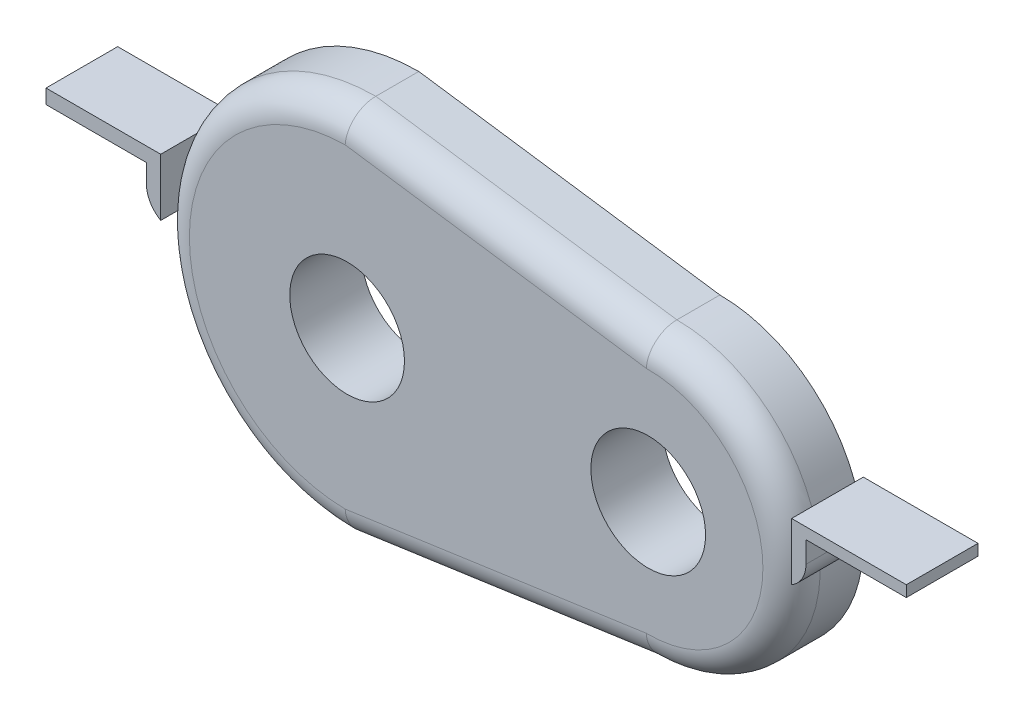
ISO-10303-21;
HEADER;
FILE_DESCRIPTION(('STEP AP214'),'2;1');
FILE_NAME('part.step','',(''),(''),'','','');
FILE_SCHEMA(('AUTOMOTIVE_DESIGN { 1 0 10303 214 1 1 1 1 }'));
ENDSEC;
DATA;
#1=APPLICATION_CONTEXT('core data for automotive mechanical design processes');
#2=APPLICATION_PROTOCOL_DEFINITION('international standard','automotive_design',2000,#1);
#3=PRODUCT_CONTEXT('',#1,'mechanical');
#4=PRODUCT('Part','Part','',(#3));
#5=PRODUCT_RELATED_PRODUCT_CATEGORY('part','',(#4));
#6=PRODUCT_DEFINITION_FORMATION('','',#4);
#7=PRODUCT_DEFINITION_CONTEXT('part definition',#1,'design');
#8=PRODUCT_DEFINITION('design','',#6,#7);
#9=PRODUCT_DEFINITION_SHAPE('','',#8);
#10=(LENGTH_UNIT() NAMED_UNIT(*) SI_UNIT(.MILLI.,.METRE.));
#11=(NAMED_UNIT(*) PLANE_ANGLE_UNIT() SI_UNIT($,.RADIAN.));
#12=(NAMED_UNIT(*) SI_UNIT($,.STERADIAN.) SOLID_ANGLE_UNIT());
#13=UNCERTAINTY_MEASURE_WITH_UNIT(LENGTH_MEASURE(1.E-05),#10,'distance_accuracy_value','');
#14=(GEOMETRIC_REPRESENTATION_CONTEXT(3) GLOBAL_UNCERTAINTY_ASSIGNED_CONTEXT((#13)) GLOBAL_UNIT_ASSIGNED_CONTEXT((#10,
#11,#12)) REPRESENTATION_CONTEXT('',''));
#15=CARTESIAN_POINT('',(0.,0.,0.));
#16=DIRECTION('',(0.,0.,1.));
#17=DIRECTION('',(1.,0.,0.));
#18=AXIS2_PLACEMENT_3D('',#15,#16,#17);
#19=CARTESIAN_POINT('',(-126.962868969595,20.,0.));
#20=DIRECTION('',(1.,0.,0.));
#21=DIRECTION('',(0.,0.,-1.));
#22=AXIS2_PLACEMENT_3D('',#19,#20,#21);
#23=PLANE('',#22);
#24=DIRECTION('',(0.,1.,0.));
#25=VECTOR('',#24,1.);
#26=CARTESIAN_POINT('',(-126.962868969595,20.,25.));
#27=LINE('',#26,#25);
#28=CARTESIAN_POINT('',(-126.962868969595,0.,25.));
#29=VERTEX_POINT('',#28);
#30=CARTESIAN_POINT('',(-126.962868969595,20.,25.));
#31=VERTEX_POINT('',#30);
#32=EDGE_CURVE('E129',#29,#31,#27,.T.);
#33=ORIENTED_EDGE('',*,*,#32,.F.);
#34=DIRECTION('',(0.,0.,1.));
#35=VECTOR('',#34,1.);
#36=CARTESIAN_POINT('',(-126.962868969595,0.,0.));
#37=LINE('',#36,#35);
#38=CARTESIAN_POINT('',(-126.962868969595,0.,0.));
#39=VERTEX_POINT('',#38);
#40=EDGE_CURVE('E117',#39,#29,#37,.T.);
#41=ORIENTED_EDGE('',*,*,#40,.F.);
#42=DIRECTION('',(0.,1.,0.));
#43=VECTOR('',#42,1.);
#44=CARTESIAN_POINT('',(-126.962868969595,20.,0.));
#45=LINE('',#44,#43);
#46=CARTESIAN_POINT('',(-126.962868969595,20.,0.));
#47=VERTEX_POINT('',#46);
#48=EDGE_CURVE('E112',#39,#47,#45,.T.);
#49=ORIENTED_EDGE('',*,*,#48,.T.);
#50=DIRECTION('',(0.,0.,1.));
#51=VECTOR('',#50,1.);
#52=CARTESIAN_POINT('',(-126.962868969595,20.,0.));
#53=LINE('',#52,#51);
#54=EDGE_CURVE('E97',#47,#31,#53,.T.);
#55=ORIENTED_EDGE('',*,*,#54,.T.);
#56=EDGE_LOOP('',(#33,#41,#49,#55));
#57=FACE_BOUND('',#56,.T.);
#58=ADVANCED_FACE('F44',(#57),#23,.T.);
#59=CARTESIAN_POINT('',(-131.962868969595,0.,0.));
#60=DIRECTION('',(-1.,0.,0.));
#61=DIRECTION('',(0.,0.,1.));
#62=AXIS2_PLACEMENT_3D('',#59,#60,#61);
#63=PLANE('',#62);
#64=DIRECTION('',(0.,-1.,0.));
#65=VECTOR('',#64,1.);
#66=CARTESIAN_POINT('',(-131.962868969595,0.,0.));
#67=LINE('',#66,#65);
#68=CARTESIAN_POINT('',(-131.962868969595,15.,0.));
#69=VERTEX_POINT('',#68);
#70=CARTESIAN_POINT('',(-131.962868969595,8.6602540378444,0.));
#71=VERTEX_POINT('',#70);
#72=EDGE_CURVE('E108',#69,#71,#67,.T.);
#73=ORIENTED_EDGE('',*,*,#72,.T.);
#74=DIRECTION('',(0.,0.,-1.));
#75=VECTOR('',#74,1.);
#76=CARTESIAN_POINT('',(-131.962868969595,8.6602540378444,25.));
#77=LINE('',#76,#75);
#78=CARTESIAN_POINT('',(-131.962868969595,8.6602540378444,25.));
#79=VERTEX_POINT('',#78);
#80=EDGE_CURVE('E138',#71,#79,#77,.F.);
#81=ORIENTED_EDGE('',*,*,#80,.T.);
#82=DIRECTION('',(0.,-1.,0.));
#83=VECTOR('',#82,1.);
#84=CARTESIAN_POINT('',(-131.962868969595,0.,25.));
#85=LINE('',#84,#83);
#86=CARTESIAN_POINT('',(-131.962868969595,15.,25.));
#87=VERTEX_POINT('',#86);
#88=EDGE_CURVE('E118',#87,#79,#85,.T.);
#89=ORIENTED_EDGE('',*,*,#88,.F.);
#90=DIRECTION('',(0.,0.,1.));
#91=VECTOR('',#90,1.);
#92=CARTESIAN_POINT('',(-131.962868969595,15.,0.));
#93=LINE('',#92,#91);
#94=EDGE_CURVE('E139',#69,#87,#93,.T.);
#95=ORIENTED_EDGE('',*,*,#94,.F.);
#96=EDGE_LOOP('',(#73,#81,#89,#95));
#97=FACE_BOUND('',#96,.T.);
#98=ADVANCED_FACE('F148',(#97),#63,.T.);
#99=CARTESIAN_POINT('',(-131.962868969595,15.,0.));
#100=DIRECTION('',(0.,-1.,0.));
#101=DIRECTION('',(1.,0.,0.));
#102=AXIS2_PLACEMENT_3D('',#99,#100,#101);
#103=PLANE('',#102);
#104=DIRECTION('',(1.,0.,0.));
#105=VECTOR('',#104,1.);
#106=CARTESIAN_POINT('',(-131.962868969595,15.,25.));
#107=LINE('',#106,#105);
#108=CARTESIAN_POINT('',(-166.962868969595,15.,25.));
#109=VERTEX_POINT('',#108);
#110=EDGE_CURVE('E121',#109,#87,#107,.T.);
#111=ORIENTED_EDGE('',*,*,#110,.F.);
#112=DIRECTION('',(0.,0.,1.));
#113=VECTOR('',#112,1.);
#114=CARTESIAN_POINT('',(-166.962868969595,15.,0.));
#115=LINE('',#114,#113);
#116=CARTESIAN_POINT('',(-166.962868969595,15.,0.));
#117=VERTEX_POINT('',#116);
#118=EDGE_CURVE('E141',#117,#109,#115,.T.);
#119=ORIENTED_EDGE('',*,*,#118,.F.);
#120=DIRECTION('',(1.,0.,0.));
#121=VECTOR('',#120,1.);
#122=CARTESIAN_POINT('',(-131.962868969595,15.,0.));
#123=LINE('',#122,#121);
#124=EDGE_CURVE('E125',#117,#69,#123,.T.);
#125=ORIENTED_EDGE('',*,*,#124,.T.);
#126=ORIENTED_EDGE('',*,*,#94,.T.);
#127=EDGE_LOOP('',(#111,#119,#125,#126));
#128=FACE_BOUND('',#127,.T.);
#129=ADVANCED_FACE('F151',(#128),#103,.T.);
#130=CARTESIAN_POINT('',(-166.962868969595,15.,0.));
#131=DIRECTION('',(-1.,0.,0.));
#132=DIRECTION('',(0.,0.,1.));
#133=AXIS2_PLACEMENT_3D('',#130,#131,#132);
#134=PLANE('',#133);
#135=DIRECTION('',(0.,-1.,0.));
#136=VECTOR('',#135,1.);
#137=CARTESIAN_POINT('',(-166.962868969595,15.,25.));
#138=LINE('',#137,#136);
#139=CARTESIAN_POINT('',(-166.962868969595,20.,25.));
#140=VERTEX_POINT('',#139);
#141=EDGE_CURVE('E132',#140,#109,#138,.T.);
#142=ORIENTED_EDGE('',*,*,#141,.F.);
#143=DIRECTION('',(0.,0.,1.));
#144=VECTOR('',#143,1.);
#145=CARTESIAN_POINT('',(-166.962868969595,20.,0.));
#146=LINE('',#145,#144);
#147=CARTESIAN_POINT('',(-166.962868969595,20.,0.));
#148=VERTEX_POINT('',#147);
#149=EDGE_CURVE('E107',#148,#140,#146,.T.);
#150=ORIENTED_EDGE('',*,*,#149,.F.);
#151=DIRECTION('',(0.,-1.,0.));
#152=VECTOR('',#151,1.);
#153=CARTESIAN_POINT('',(-166.962868969595,15.,0.));
#154=LINE('',#153,#152);
#155=EDGE_CURVE('E115',#148,#117,#154,.T.);
#156=ORIENTED_EDGE('',*,*,#155,.T.);
#157=ORIENTED_EDGE('',*,*,#118,.T.);
#158=EDGE_LOOP('',(#142,#150,#156,#157));
#159=FACE_BOUND('',#158,.T.);
#160=ADVANCED_FACE('F154',(#159),#134,.T.);
#161=CARTESIAN_POINT('',(-166.962868969595,20.,0.));
#162=DIRECTION('',(0.,1.,0.));
#163=DIRECTION('',(0.,0.,1.));
#164=AXIS2_PLACEMENT_3D('',#161,#162,#163);
#165=PLANE('',#164);
#166=DIRECTION('',(-1.,0.,0.));
#167=VECTOR('',#166,1.);
#168=CARTESIAN_POINT('',(-166.962868969595,20.,25.));
#169=LINE('',#168,#167);
#170=EDGE_CURVE('E102',#31,#140,#169,.T.);
#171=ORIENTED_EDGE('',*,*,#170,.F.);
#172=ORIENTED_EDGE('',*,*,#54,.F.);
#173=DIRECTION('',(-1.,0.,0.));
#174=VECTOR('',#173,1.);
#175=CARTESIAN_POINT('',(-166.962868969595,20.,0.));
#176=LINE('',#175,#174);
#177=EDGE_CURVE('E100',#47,#148,#176,.T.);
#178=ORIENTED_EDGE('',*,*,#177,.T.);
#179=ORIENTED_EDGE('',*,*,#149,.T.);
#180=EDGE_LOOP('',(#171,#172,#178,#179));
#181=FACE_BOUND('',#180,.T.);
#182=ADVANCED_FACE('F99',(#181),#165,.T.);
#183=CARTESIAN_POINT('',(0.,0.,0.));
#184=DIRECTION('',(0.,0.,-1.));
#185=DIRECTION('',(-1.,0.,0.));
#186=AXIS2_PLACEMENT_3D('',#183,#184,#185);
#187=PLANE('',#186);
#188=ORIENTED_EDGE('',*,*,#48,.F.);
#189=CARTESIAN_POINT('',(-121.962868969595,8.6602540378444,0.));
#190=DIRECTION('',(0.,0.,-1.));
#191=DIRECTION('',(-1.,0.,0.));
#192=AXIS2_PLACEMENT_3D('',#189,#190,#191);
#193=CIRCLE('',#192,10.);
#194=EDGE_CURVE('E12',#39,#71,#193,.T.);
#195=ORIENTED_EDGE('',*,*,#194,.T.);
#196=ORIENTED_EDGE('',*,*,#72,.F.);
#197=ORIENTED_EDGE('',*,*,#124,.F.);
#198=ORIENTED_EDGE('',*,*,#155,.F.);
#199=ORIENTED_EDGE('',*,*,#177,.F.);
#200=EDGE_LOOP('',(#188,#195,#196,#197,#198,#199));
#201=FACE_BOUND('',#200,.T.);
#202=ADVANCED_FACE('F111',(#201),#187,.T.);
#203=CARTESIAN_POINT('',(0.,0.,25.));
#204=DIRECTION('',(0.,0.,-1.));
#205=DIRECTION('',(-1.,0.,0.));
#206=AXIS2_PLACEMENT_3D('',#203,#204,#205);
#207=PLANE('',#206);
#208=ORIENTED_EDGE('',*,*,#88,.T.);
#209=CARTESIAN_POINT('',(-121.962868969595,8.6602540378444,25.));
#210=DIRECTION('',(0.,0.,-1.));
#211=DIRECTION('',(-1.,0.,0.));
#212=AXIS2_PLACEMENT_3D('',#209,#210,#211);
#213=CIRCLE('',#212,10.);
#214=EDGE_CURVE('E52',#79,#29,#213,.F.);
#215=ORIENTED_EDGE('',*,*,#214,.T.);
#216=ORIENTED_EDGE('',*,*,#32,.T.);
#217=ORIENTED_EDGE('',*,*,#170,.T.);
#218=ORIENTED_EDGE('',*,*,#141,.T.);
#219=ORIENTED_EDGE('',*,*,#110,.T.);
#220=EDGE_LOOP('',(#208,#215,#216,#217,#218,#219));
#221=FACE_BOUND('',#220,.T.);
#222=ADVANCED_FACE('F145',(#221),#207,.F.);
#223=CARTESIAN_POINT('',(-121.962868969595,8.6602540378444,0.));
#224=DIRECTION('',(0.,0.,1.));
#225=DIRECTION('',(1.,0.,0.));
#226=AXIS2_PLACEMENT_3D('',#223,#224,#225);
#227=CYLINDRICAL_SURFACE('',#226,10.);
#228=ORIENTED_EDGE('',*,*,#194,.F.);
#229=ORIENTED_EDGE('',*,*,#40,.T.);
#230=ORIENTED_EDGE('',*,*,#214,.F.);
#231=ORIENTED_EDGE('',*,*,#80,.F.);
#232=EDGE_LOOP('',(#228,#229,#230,#231));
#233=FACE_BOUND('',#232,.T.);
#234=ADVANCED_FACE('F46',(#233),#227,.T.);
#235=CLOSED_SHELL('',(#58,#98,#129,#160,#182,#202,#222,#234));
#236=MANIFOLD_SOLID_BREP('B2',#235);
#237=CARTESIAN_POINT('',(93.0371310304046,0.,0.));
#238=DIRECTION('',(-1.,0.,0.));
#239=DIRECTION('',(0.,0.,1.));
#240=AXIS2_PLACEMENT_3D('',#237,#238,#239);
#241=PLANE('',#240);
#242=DIRECTION('',(0.,-1.,0.));
#243=VECTOR('',#242,1.);
#244=CARTESIAN_POINT('',(93.0371310304046,0.,25.));
#245=LINE('',#244,#243);
#246=CARTESIAN_POINT('',(93.0371310304046,20.,25.));
#247=VERTEX_POINT('',#246);
#248=CARTESIAN_POINT('',(93.0371310304046,0.,25.));
#249=VERTEX_POINT('',#248);
#250=EDGE_CURVE('E287',#247,#249,#245,.T.);
#251=ORIENTED_EDGE('',*,*,#250,.F.);
#252=DIRECTION('',(0.,0.,1.));
#253=VECTOR('',#252,1.);
#254=CARTESIAN_POINT('',(93.0371310304046,20.,0.));
#255=LINE('',#254,#253);
#256=CARTESIAN_POINT('',(93.0371310304046,20.,0.));
#257=VERTEX_POINT('',#256);
#258=EDGE_CURVE('E323',#257,#247,#255,.T.);
#259=ORIENTED_EDGE('',*,*,#258,.F.);
#260=DIRECTION('',(0.,-1.,0.));
#261=VECTOR('',#260,1.);
#262=CARTESIAN_POINT('',(93.0371310304046,0.,0.));
#263=LINE('',#262,#261);
#264=CARTESIAN_POINT('',(93.0371310304046,0.,0.));
#265=VERTEX_POINT('',#264);
#266=EDGE_CURVE('E295',#257,#265,#263,.T.);
#267=ORIENTED_EDGE('',*,*,#266,.T.);
#268=DIRECTION('',(0.,0.,1.));
#269=VECTOR('',#268,1.);
#270=CARTESIAN_POINT('',(93.0371310304046,0.,0.));
#271=LINE('',#270,#269);
#272=EDGE_CURVE('E320',#265,#249,#271,.T.);
#273=ORIENTED_EDGE('',*,*,#272,.T.);
#274=EDGE_LOOP('',(#251,#259,#267,#273));
#275=FACE_BOUND('',#274,.T.);
#276=ADVANCED_FACE('F229',(#275),#241,.T.);
#277=CARTESIAN_POINT('',(93.0371310304046,20.,0.));
#278=DIRECTION('',(0.,1.,0.));
#279=DIRECTION('',(0.,0.,1.));
#280=AXIS2_PLACEMENT_3D('',#277,#278,#279);
#281=PLANE('',#280);
#282=DIRECTION('',(-1.,0.,0.));
#283=VECTOR('',#282,1.);
#284=CARTESIAN_POINT('',(93.0371310304046,20.,25.));
#285=LINE('',#284,#283);
#286=CARTESIAN_POINT('',(133.037131030405,20.,25.));
#287=VERTEX_POINT('',#286);
#288=EDGE_CURVE('E316',#287,#247,#285,.T.);
#289=ORIENTED_EDGE('',*,*,#288,.F.);
#290=DIRECTION('',(0.,0.,1.));
#291=VECTOR('',#290,1.);
#292=CARTESIAN_POINT('',(133.037131030405,20.,0.));
#293=LINE('',#292,#291);
#294=CARTESIAN_POINT('',(133.037131030405,20.,0.));
#295=VERTEX_POINT('',#294);
#296=EDGE_CURVE('E325',#295,#287,#293,.T.);
#297=ORIENTED_EDGE('',*,*,#296,.F.);
#298=DIRECTION('',(-1.,0.,0.));
#299=VECTOR('',#298,1.);
#300=CARTESIAN_POINT('',(93.0371310304046,20.,0.));
#301=LINE('',#300,#299);
#302=EDGE_CURVE('E303',#295,#257,#301,.T.);
#303=ORIENTED_EDGE('',*,*,#302,.T.);
#304=ORIENTED_EDGE('',*,*,#258,.T.);
#305=EDGE_LOOP('',(#289,#297,#303,#304));
#306=FACE_BOUND('',#305,.T.);
#307=ADVANCED_FACE('F339',(#306),#281,.T.);
#308=CARTESIAN_POINT('',(133.037131030405,20.,0.));
#309=DIRECTION('',(1.,0.,0.));
#310=DIRECTION('',(0.,0.,-1.));
#311=AXIS2_PLACEMENT_3D('',#308,#309,#310);
#312=PLANE('',#311);
#313=DIRECTION('',(0.,1.,0.));
#314=VECTOR('',#313,1.);
#315=CARTESIAN_POINT('',(133.037131030405,20.,25.));
#316=LINE('',#315,#314);
#317=CARTESIAN_POINT('',(133.037131030405,16.1048250273839,25.));
#318=VERTEX_POINT('',#317);
#319=EDGE_CURVE('E313',#318,#287,#316,.T.);
#320=ORIENTED_EDGE('',*,*,#319,.F.);
#321=DIRECTION('',(0.,0.,1.));
#322=VECTOR('',#321,1.);
#323=CARTESIAN_POINT('',(133.037131030405,16.1048250273839,0.));
#324=LINE('',#323,#322);
#325=CARTESIAN_POINT('',(133.037131030405,16.1048250273839,0.));
#326=VERTEX_POINT('',#325);
#327=EDGE_CURVE('E294',#326,#318,#324,.T.);
#328=ORIENTED_EDGE('',*,*,#327,.F.);
#329=DIRECTION('',(0.,1.,0.));
#330=VECTOR('',#329,1.);
#331=CARTESIAN_POINT('',(133.037131030405,20.,0.));
#332=LINE('',#331,#330);
#333=EDGE_CURVE('E301',#326,#295,#332,.T.);
#334=ORIENTED_EDGE('',*,*,#333,.T.);
#335=ORIENTED_EDGE('',*,*,#296,.T.);
#336=EDGE_LOOP('',(#320,#328,#334,#335));
#337=FACE_BOUND('',#336,.T.);
#338=ADVANCED_FACE('F330',(#337),#312,.T.);
#339=CARTESIAN_POINT('',(133.037131030405,16.1048250273839,0.));
#340=DIRECTION('',(0.,-1.,0.));
#341=DIRECTION('',(0.,0.,-1.));
#342=AXIS2_PLACEMENT_3D('',#339,#340,#341);
#343=PLANE('',#342);
#344=DIRECTION('',(1.,0.,0.));
#345=VECTOR('',#344,1.);
#346=CARTESIAN_POINT('',(133.037131030405,16.1048250273839,25.));
#347=LINE('',#346,#345);
#348=CARTESIAN_POINT('',(98.0371310304046,16.1048250273839,25.));
#349=VERTEX_POINT('',#348);
#350=EDGE_CURVE('E293',#349,#318,#347,.T.);
#351=ORIENTED_EDGE('',*,*,#350,.F.);
#352=DIRECTION('',(0.,0.,1.));
#353=VECTOR('',#352,1.);
#354=CARTESIAN_POINT('',(98.0371310304046,16.1048250273839,0.));
#355=LINE('',#354,#353);
#356=CARTESIAN_POINT('',(98.0371310304046,16.1048250273839,0.));
#357=VERTEX_POINT('',#356);
#358=EDGE_CURVE('E281',#357,#349,#355,.T.);
#359=ORIENTED_EDGE('',*,*,#358,.F.);
#360=DIRECTION('',(1.,0.,0.));
#361=VECTOR('',#360,1.);
#362=CARTESIAN_POINT('',(133.037131030405,16.1048250273839,0.));
#363=LINE('',#362,#361);
#364=EDGE_CURVE('E286',#357,#326,#363,.T.);
#365=ORIENTED_EDGE('',*,*,#364,.T.);
#366=ORIENTED_EDGE('',*,*,#327,.T.);
#367=EDGE_LOOP('',(#351,#359,#365,#366));
#368=FACE_BOUND('',#367,.T.);
#369=ADVANCED_FACE('F291',(#368),#343,.T.);
#370=CARTESIAN_POINT('',(98.0371310304046,16.1048250273839,0.));
#371=DIRECTION('',(1.,0.,0.));
#372=DIRECTION('',(0.,0.,-1.));
#373=AXIS2_PLACEMENT_3D('',#370,#371,#372);
#374=PLANE('',#373);
#375=DIRECTION('',(0.,1.,0.));
#376=VECTOR('',#375,1.);
#377=CARTESIAN_POINT('',(98.0371310304046,16.1048250273839,25.));
#378=LINE('',#377,#376);
#379=CARTESIAN_POINT('',(98.0371310304046,8.66025403784439,25.));
#380=VERTEX_POINT('',#379);
#381=EDGE_CURVE('E310',#380,#349,#378,.T.);
#382=ORIENTED_EDGE('',*,*,#381,.F.);
#383=DIRECTION('',(0.,0.,1.));
#384=VECTOR('',#383,1.);
#385=CARTESIAN_POINT('',(98.0371310304046,8.66025403784439,0.));
#386=LINE('',#385,#384);
#387=CARTESIAN_POINT('',(98.0371310304046,8.66025403784439,0.));
#388=VERTEX_POINT('',#387);
#389=EDGE_CURVE('E237',#380,#388,#386,.F.);
#390=ORIENTED_EDGE('',*,*,#389,.T.);
#391=DIRECTION('',(0.,1.,0.));
#392=VECTOR('',#391,1.);
#393=CARTESIAN_POINT('',(98.0371310304046,16.1048250273839,0.));
#394=LINE('',#393,#392);
#395=EDGE_CURVE('E278',#388,#357,#394,.T.);
#396=ORIENTED_EDGE('',*,*,#395,.T.);
#397=ORIENTED_EDGE('',*,*,#358,.T.);
#398=EDGE_LOOP('',(#382,#390,#396,#397));
#399=FACE_BOUND('',#398,.T.);
#400=ADVANCED_FACE('F280',(#399),#374,.T.);
#401=CARTESIAN_POINT('',(0.,0.,0.));
#402=DIRECTION('',(0.,0.,-1.));
#403=DIRECTION('',(-1.,0.,0.));
#404=AXIS2_PLACEMENT_3D('',#401,#402,#403);
#405=PLANE('',#404);
#406=ORIENTED_EDGE('',*,*,#395,.F.);
#407=CARTESIAN_POINT('',(88.0371310304046,8.66025403784439,0.));
#408=DIRECTION('',(0.,0.,-1.));
#409=DIRECTION('',(-1.,0.,0.));
#410=AXIS2_PLACEMENT_3D('',#407,#408,#409);
#411=CIRCLE('',#410,10.);
#412=EDGE_CURVE('E42',#388,#265,#411,.T.);
#413=ORIENTED_EDGE('',*,*,#412,.T.);
#414=ORIENTED_EDGE('',*,*,#266,.F.);
#415=ORIENTED_EDGE('',*,*,#302,.F.);
#416=ORIENTED_EDGE('',*,*,#333,.F.);
#417=ORIENTED_EDGE('',*,*,#364,.F.);
#418=EDGE_LOOP('',(#406,#413,#414,#415,#416,#417));
#419=FACE_BOUND('',#418,.T.);
#420=ADVANCED_FACE('F298',(#419),#405,.T.);
#421=CARTESIAN_POINT('',(0.,0.,25.));
#422=DIRECTION('',(0.,0.,-1.));
#423=DIRECTION('',(-1.,0.,0.));
#424=AXIS2_PLACEMENT_3D('',#421,#422,#423);
#425=PLANE('',#424);
#426=ORIENTED_EDGE('',*,*,#250,.T.);
#427=CARTESIAN_POINT('',(88.0371310304046,8.66025403784439,25.));
#428=DIRECTION('',(0.,0.,-1.));
#429=DIRECTION('',(-1.,0.,0.));
#430=AXIS2_PLACEMENT_3D('',#427,#428,#429);
#431=CIRCLE('',#430,10.);
#432=EDGE_CURVE('E251',#249,#380,#431,.F.);
#433=ORIENTED_EDGE('',*,*,#432,.T.);
#434=ORIENTED_EDGE('',*,*,#381,.T.);
#435=ORIENTED_EDGE('',*,*,#350,.T.);
#436=ORIENTED_EDGE('',*,*,#319,.T.);
#437=ORIENTED_EDGE('',*,*,#288,.T.);
#438=EDGE_LOOP('',(#426,#433,#434,#435,#436,#437));
#439=FACE_BOUND('',#438,.T.);
#440=ADVANCED_FACE('F332',(#439),#425,.F.);
#441=CARTESIAN_POINT('',(88.0371310304046,8.66025403784439,0.));
#442=DIRECTION('',(0.,0.,-1.));
#443=DIRECTION('',(-1.,0.,0.));
#444=AXIS2_PLACEMENT_3D('',#441,#442,#443);
#445=CYLINDRICAL_SURFACE('',#444,10.);
#446=ORIENTED_EDGE('',*,*,#412,.F.);
#447=ORIENTED_EDGE('',*,*,#389,.F.);
#448=ORIENTED_EDGE('',*,*,#432,.F.);
#449=ORIENTED_EDGE('',*,*,#272,.F.);
#450=EDGE_LOOP('',(#446,#447,#448,#449));
#451=FACE_BOUND('',#450,.T.);
#452=ADVANCED_FACE('F231',(#451),#445,.T.);
#453=CLOSED_SHELL('',(#276,#307,#338,#369,#400,#420,#440,#452));
#454=MANIFOLD_SOLID_BREP('B6',#453);
#455=CARTESIAN_POINT('',(-61.9628689695954,0.,25.));
#456=DIRECTION('',(0.,0.,1.));
#457=DIRECTION('',(1.,0.,0.));
#458=AXIS2_PLACEMENT_3D('',#455,#456,#457);
#459=PLANE('',#458);
#460=DIRECTION('',(0.989949493661167,0.14142135623731,0.));
#461=VECTOR('',#460,1.);
#462=CARTESIAN_POINT('',(41.6229174680315,-40.1005050633883,25.));
#463=LINE('',#462,#461);
#464=CARTESIAN_POINT('',(-62.6440207368512,-54.9957819498002,25.));
#465=VERTEX_POINT('',#464);
#466=CARTESIAN_POINT('',(42.365881125805,-39.9943673979921,25.));
#467=VERTEX_POINT('',#466);
#468=EDGE_CURVE('E496',#465,#467,#463,.T.);
#469=ORIENTED_EDGE('',*,*,#468,.T.);
#470=CARTESIAN_POINT('',(43.0371310304046,0.,25.));
#471=DIRECTION('',(0.,0.,1.));
#472=DIRECTION('',(1.,0.,0.));
#473=AXIS2_PLACEMENT_3D('',#470,#471,#472);
#474=CIRCLE('',#473,40.);
#475=CARTESIAN_POINT('',(42.365881125805,39.9943673979921,25.));
#476=VERTEX_POINT('',#475);
#477=EDGE_CURVE('E498',#467,#476,#474,.T.);
#478=ORIENTED_EDGE('',*,*,#477,.T.);
#479=DIRECTION('',(-0.989949493661167,0.14142135623731,0.));
#480=VECTOR('',#479,1.);
#481=CARTESIAN_POINT('',(-63.3770825319685,55.1005050633883,25.));
#482=LINE('',#481,#480);
#483=CARTESIAN_POINT('',(-62.6440207368512,54.9957819498002,25.));
#484=VERTEX_POINT('',#483);
#485=EDGE_CURVE('E476',#476,#484,#482,.T.);
#486=ORIENTED_EDGE('',*,*,#485,.T.);
#487=CARTESIAN_POINT('',(-61.9628689695954,0.,25.));
#488=DIRECTION('',(0.,0.,1.));
#489=DIRECTION('',(1.,0.,0.));
#490=AXIS2_PLACEMENT_3D('',#487,#488,#489);
#491=CIRCLE('',#490,55.);
#492=EDGE_CURVE('E494',#484,#465,#491,.T.);
#493=ORIENTED_EDGE('',*,*,#492,.T.);
#494=EDGE_LOOP('',(#469,#478,#486,#493));
#495=FACE_BOUND('',#494,.T.);
#496=CARTESIAN_POINT('',(-61.9628689695954,0.,25.));
#497=DIRECTION('',(0.,0.,1.));
#498=DIRECTION('',(1.,0.,0.));
#499=AXIS2_PLACEMENT_3D('',#496,#497,#498);
#500=CIRCLE('',#499,20.);
#501=CARTESIAN_POINT('',(-41.9628689695954,0.,25.));
#502=VERTEX_POINT('',#501);
#503=EDGE_CURVE('E471',#502,#502,#500,.T.);
#504=ORIENTED_EDGE('',*,*,#503,.F.);
#505=EDGE_LOOP('',(#504));
#506=FACE_BOUND('',#505,.T.);
#507=CARTESIAN_POINT('',(43.0371310304046,0.,25.));
#508=DIRECTION('',(0.,0.,1.));
#509=DIRECTION('',(1.,0.,0.));
#510=AXIS2_PLACEMENT_3D('',#507,#508,#509);
#511=CIRCLE('',#510,20.);
#512=CARTESIAN_POINT('',(63.0371310304046,0.,25.));
#513=VERTEX_POINT('',#512);
#514=EDGE_CURVE('E622',#513,#513,#511,.T.);
#515=ORIENTED_EDGE('',*,*,#514,.F.);
#516=EDGE_LOOP('',(#515));
#517=FACE_BOUND('',#516,.T.);
#518=ADVANCED_FACE('F405',(#495,#506,#517),#459,.T.);
#519=CARTESIAN_POINT('',(-61.9628689695954,0.,0.));
#520=DIRECTION('',(0.,0.,1.));
#521=DIRECTION('',(1.,0.,0.));
#522=AXIS2_PLACEMENT_3D('',#519,#520,#521);
#523=PLANE('',#522);
#524=CARTESIAN_POINT('',(-61.9628689695954,0.,0.));
#525=DIRECTION('',(0.,0.,1.));
#526=DIRECTION('',(1.,0.,0.));
#527=AXIS2_PLACEMENT_3D('',#524,#525,#526);
#528=CIRCLE('',#527,65.);
#529=CARTESIAN_POINT('',(-61.9628689695954,65.,0.));
#530=VERTEX_POINT('',#529);
#531=CARTESIAN_POINT('',(-61.9628689695954,-65.,0.));
#532=VERTEX_POINT('',#531);
#533=EDGE_CURVE('E462',#530,#532,#528,.T.);
#534=ORIENTED_EDGE('',*,*,#533,.F.);
#535=DIRECTION('',(-0.989949493661167,0.14142135623731,0.));
#536=VECTOR('',#535,1.);
#537=CARTESIAN_POINT('',(-61.9628689695954,65.,0.));
#538=LINE('',#537,#536);
#539=CARTESIAN_POINT('',(43.0371310304046,50.,0.));
#540=VERTEX_POINT('',#539);
#541=EDGE_CURVE('E483',#540,#530,#538,.T.);
#542=ORIENTED_EDGE('',*,*,#541,.F.);
#543=CARTESIAN_POINT('',(43.0371310304046,0.,0.));
#544=DIRECTION('',(0.,0.,1.));
#545=DIRECTION('',(1.,0.,0.));
#546=AXIS2_PLACEMENT_3D('',#543,#544,#545);
#547=CIRCLE('',#546,50.);
#548=CARTESIAN_POINT('',(43.0371310304046,-50.,0.));
#549=VERTEX_POINT('',#548);
#550=EDGE_CURVE('E481',#549,#540,#547,.T.);
#551=ORIENTED_EDGE('',*,*,#550,.F.);
#552=DIRECTION('',(0.989949493661167,0.14142135623731,0.));
#553=VECTOR('',#552,1.);
#554=CARTESIAN_POINT('',(-61.9628689695954,-65.,0.));
#555=LINE('',#554,#553);
#556=EDGE_CURVE('E470',#532,#549,#555,.T.);
#557=ORIENTED_EDGE('',*,*,#556,.F.);
#558=EDGE_LOOP('',(#534,#542,#551,#557));
#559=FACE_BOUND('',#558,.T.);
#560=CARTESIAN_POINT('',(-61.9628689695954,0.,0.));
#561=DIRECTION('',(0.,0.,1.));
#562=DIRECTION('',(1.,0.,0.));
#563=AXIS2_PLACEMENT_3D('',#560,#561,#562);
#564=CIRCLE('',#563,20.);
#565=CARTESIAN_POINT('',(-41.9628689695954,0.,0.));
#566=VERTEX_POINT('',#565);
#567=EDGE_CURVE('E628',#566,#566,#564,.T.);
#568=ORIENTED_EDGE('',*,*,#567,.T.);
#569=EDGE_LOOP('',(#568));
#570=FACE_BOUND('',#569,.T.);
#571=CARTESIAN_POINT('',(43.0371310304046,0.,0.));
#572=DIRECTION('',(0.,0.,1.));
#573=DIRECTION('',(1.,0.,0.));
#574=AXIS2_PLACEMENT_3D('',#571,#572,#573);
#575=CIRCLE('',#574,20.);
#576=CARTESIAN_POINT('',(63.0371310304046,0.,0.));
#577=VERTEX_POINT('',#576);
#578=EDGE_CURVE('E625',#577,#577,#575,.T.);
#579=ORIENTED_EDGE('',*,*,#578,.T.);
#580=EDGE_LOOP('',(#579));
#581=FACE_BOUND('',#580,.T.);
#582=ADVANCED_FACE('F479',(#559,#570,#581),#523,.F.);
#583=CARTESIAN_POINT('',(-61.9628689695954,0.,25.));
#584=DIRECTION('',(0.,0.,-1.));
#585=DIRECTION('',(-1.,0.,0.));
#586=AXIS2_PLACEMENT_3D('',#583,#584,#585);
#587=CYLINDRICAL_SURFACE('',#586,65.);
#588=CARTESIAN_POINT('',(-61.9628689695954,0.,15.));
#589=DIRECTION('',(0.,0.,1.));
#590=DIRECTION('',(1.,0.,0.));
#591=AXIS2_PLACEMENT_3D('',#588,#589,#590);
#592=CIRCLE('',#591,65.);
#593=CARTESIAN_POINT('',(-61.9628689695954,-65.,15.));
#594=VERTEX_POINT('',#593);
#595=CARTESIAN_POINT('',(-61.9628689695954,65.,15.));
#596=VERTEX_POINT('',#595);
#597=EDGE_CURVE('E418',#594,#596,#592,.F.);
#598=ORIENTED_EDGE('',*,*,#597,.T.);
#599=DIRECTION('',(0.,0.,-1.));
#600=VECTOR('',#599,1.);
#601=CARTESIAN_POINT('',(-61.9628689695954,65.,25.));
#602=LINE('',#601,#600);
#603=EDGE_CURVE('E465',#596,#530,#602,.T.);
#604=ORIENTED_EDGE('',*,*,#603,.T.);
#605=ORIENTED_EDGE('',*,*,#533,.T.);
#606=DIRECTION('',(0.,0.,-1.));
#607=VECTOR('',#606,1.);
#608=CARTESIAN_POINT('',(-61.9628689695954,-65.,25.));
#609=LINE('',#608,#607);
#610=EDGE_CURVE('E464',#594,#532,#609,.T.);
#611=ORIENTED_EDGE('',*,*,#610,.F.);
#612=EDGE_LOOP('',(#598,#604,#605,#611));
#613=FACE_BOUND('',#612,.T.);
#614=ADVANCED_FACE('F463',(#613),#587,.T.);
#615=CARTESIAN_POINT('',(-61.9628689695954,-65.,25.));
#616=DIRECTION('',(-0.14142135623731,0.989949493661167,0.));
#617=DIRECTION('',(-0.989949493661167,-0.14142135623731,0.));
#618=AXIS2_PLACEMENT_3D('',#615,#616,#617);
#619=PLANE('',#618);
#620=DIRECTION('',(0.,0.,-1.));
#621=VECTOR('',#620,1.);
#622=CARTESIAN_POINT('',(43.0371310304046,-50.,25.));
#623=LINE('',#622,#621);
#624=CARTESIAN_POINT('',(43.0371310304046,-50.,15.));
#625=VERTEX_POINT('',#624);
#626=EDGE_CURVE('E477',#625,#549,#623,.T.);
#627=ORIENTED_EDGE('',*,*,#626,.F.);
#628=DIRECTION('',(0.989949493661167,0.14142135623731,0.));
#629=VECTOR('',#628,1.);
#630=CARTESIAN_POINT('',(-61.9628689695954,-65.,15.));
#631=LINE('',#630,#629);
#632=EDGE_CURVE('E433',#625,#594,#631,.F.);
#633=ORIENTED_EDGE('',*,*,#632,.T.);
#634=ORIENTED_EDGE('',*,*,#610,.T.);
#635=ORIENTED_EDGE('',*,*,#556,.T.);
#636=EDGE_LOOP('',(#627,#633,#634,#635));
#637=FACE_BOUND('',#636,.T.);
#638=ADVANCED_FACE('F474',(#637),#619,.F.);
#639=CARTESIAN_POINT('',(43.0371310304046,0.,25.));
#640=DIRECTION('',(0.,0.,-1.));
#641=DIRECTION('',(-1.,0.,0.));
#642=AXIS2_PLACEMENT_3D('',#639,#640,#641);
#643=CYLINDRICAL_SURFACE('',#642,50.);
#644=CARTESIAN_POINT('',(43.0371310304046,0.,15.));
#645=DIRECTION('',(0.,0.,1.));
#646=DIRECTION('',(1.,0.,0.));
#647=AXIS2_PLACEMENT_3D('',#644,#645,#646);
#648=CIRCLE('',#647,50.);
#649=CARTESIAN_POINT('',(43.0371310304046,50.,15.));
#650=VERTEX_POINT('',#649);
#651=EDGE_CURVE('E501',#650,#625,#648,.F.);
#652=ORIENTED_EDGE('',*,*,#651,.T.);
#653=ORIENTED_EDGE('',*,*,#626,.T.);
#654=ORIENTED_EDGE('',*,*,#550,.T.);
#655=DIRECTION('',(0.,0.,-1.));
#656=VECTOR('',#655,1.);
#657=CARTESIAN_POINT('',(43.0371310304046,50.,25.));
#658=LINE('',#657,#656);
#659=EDGE_CURVE('E489',#650,#540,#658,.T.);
#660=ORIENTED_EDGE('',*,*,#659,.F.);
#661=EDGE_LOOP('',(#652,#653,#654,#660));
#662=FACE_BOUND('',#661,.T.);
#663=ADVANCED_FACE('F552',(#662),#643,.T.);
#664=CARTESIAN_POINT('',(-61.9628689695954,65.,25.));
#665=DIRECTION('',(-0.14142135623731,-0.989949493661167,0.));
#666=DIRECTION('',(0.989949493661167,-0.14142135623731,0.));
#667=AXIS2_PLACEMENT_3D('',#664,#665,#666);
#668=PLANE('',#667);
#669=ORIENTED_EDGE('',*,*,#603,.F.);
#670=DIRECTION('',(-0.989949493661167,0.14142135623731,0.));
#671=VECTOR('',#670,1.);
#672=CARTESIAN_POINT('',(43.0371310304046,50.,15.));
#673=LINE('',#672,#671);
#674=EDGE_CURVE('E227',#596,#650,#673,.F.);
#675=ORIENTED_EDGE('',*,*,#674,.T.);
#676=ORIENTED_EDGE('',*,*,#659,.T.);
#677=ORIENTED_EDGE('',*,*,#541,.T.);
#678=EDGE_LOOP('',(#669,#675,#676,#677));
#679=FACE_BOUND('',#678,.T.);
#680=ADVANCED_FACE('F549',(#679),#668,.F.);
#681=CARTESIAN_POINT('',(-61.9628689695954,0.,25.));
#682=DIRECTION('',(0.,0.,-1.));
#683=DIRECTION('',(-1.,0.,0.));
#684=AXIS2_PLACEMENT_3D('',#681,#682,#683);
#685=CYLINDRICAL_SURFACE('',#684,20.);
#686=ORIENTED_EDGE('',*,*,#503,.T.);
#687=EDGE_LOOP('',(#686));
#688=FACE_BOUND('',#687,.T.);
#689=ORIENTED_EDGE('',*,*,#567,.F.);
#690=EDGE_LOOP('',(#689));
#691=FACE_BOUND('',#690,.T.);
#692=ADVANCED_FACE('F546',(#688,#691),#685,.F.);
#693=CARTESIAN_POINT('',(43.0371310304046,0.,25.));
#694=DIRECTION('',(0.,0.,-1.));
#695=DIRECTION('',(-1.,0.,0.));
#696=AXIS2_PLACEMENT_3D('',#693,#694,#695);
#697=CYLINDRICAL_SURFACE('',#696,20.);
#698=ORIENTED_EDGE('',*,*,#514,.T.);
#699=EDGE_LOOP('',(#698));
#700=FACE_BOUND('',#699,.T.);
#701=ORIENTED_EDGE('',*,*,#578,.F.);
#702=EDGE_LOOP('',(#701));
#703=FACE_BOUND('',#702,.T.);
#704=ADVANCED_FACE('F534',(#700,#703),#697,.F.);
#705=CARTESIAN_POINT('',(-61.9628689695954,0.,15.));
#706=DIRECTION('',(0.,0.,1.));
#707=DIRECTION('',(1.,0.,0.));
#708=AXIS2_PLACEMENT_3D('',#705,#706,#707);
#709=TOROIDAL_SURFACE('',#708,55.,10.);
#710=CARTESIAN_POINT('',(-61.9628689695954,65.,15.));
#711=CARTESIAN_POINT('',(-61.9628663073714,65.000030533291,15.2807252859375));
#712=CARTESIAN_POINT('',(-61.9637089533561,64.9881802830703,15.5614459809915));
#713=CARTESIAN_POINT('',(-61.9670656407086,64.9409388919112,16.1208753426604));
#714=CARTESIAN_POINT('',(-61.9695795942968,64.9055489873099,16.3995841141674));
#715=CARTESIAN_POINT('',(-61.976257144335,64.8114846336704,16.9528066464326));
#716=CARTESIAN_POINT('',(-61.9804194871891,64.7528278789574,17.2273234308016));
#717=CARTESIAN_POINT('',(-61.9903562629869,64.6126619863341,17.7704259260203));
#718=CARTESIAN_POINT('',(-61.9961306777167,64.531153106615,18.0390117038435));
#719=CARTESIAN_POINT('',(-62.0092440117954,64.3458246534351,18.5684675229033));
#720=CARTESIAN_POINT('',(-62.0165836277246,64.2419951461911,18.8293340697001));
#721=CARTESIAN_POINT('',(-62.0327616535705,64.0127910797766,19.3413822501519));
#722=CARTESIAN_POINT('',(-62.0416000969921,63.887416038974,19.5925636671503));
#723=CARTESIAN_POINT('',(-62.0606965270336,63.6160518255368,20.0834031237404));
#724=CARTESIAN_POINT('',(-62.0709541988493,63.470067224236,20.3230637029687));
#725=CARTESIAN_POINT('',(-62.0928017078413,63.1585086703679,20.7892278784221));
#726=CARTESIAN_POINT('',(-62.1043915388973,62.9929348078004,21.0157315350875));
#727=CARTESIAN_POINT('',(-62.1288162929623,62.6432009825731,21.4542119989083));
#728=CARTESIAN_POINT('',(-62.141652475965,62.45902220361,21.6661737277689));
#729=CARTESIAN_POINT('',(-62.1684503987606,62.073534566584,22.0738245632704));
#730=CARTESIAN_POINT('',(-62.1824121411244,61.8722256693956,22.2695136327422));
#731=CARTESIAN_POINT('',(-62.211347641455,61.4538468001873,22.6433037691131));
#732=CARTESIAN_POINT('',(-62.22632171435,61.2367719219172,22.8213993200015));
#733=CARTESIAN_POINT('',(-62.257152404984,60.7884644592349,23.1586830794464));
#734=CARTESIAN_POINT('',(-62.2730090087234,60.557232099397,23.3178715877999));
#735=CARTESIAN_POINT('',(-62.3055168029656,60.0816195532632,23.6166273315092));
#736=CARTESIAN_POINT('',(-62.322169978583,59.8372063032052,23.7561417170979));
#737=CARTESIAN_POINT('',(-62.3560951924176,59.3375371717053,24.0140715682354));
#738=CARTESIAN_POINT('',(-62.3733672213882,59.0822814522574,24.1324873488746));
#739=CARTESIAN_POINT('',(-62.4083813440492,58.562878513553,24.3473368412294));
#740=CARTESIAN_POINT('',(-62.4261231648524,58.2987364329833,24.4437830147459));
#741=CARTESIAN_POINT('',(-62.4619392950973,57.7633878560283,24.6140831792672));
#742=CARTESIAN_POINT('',(-62.4800135098323,57.492183363,24.6879435029328));
#743=CARTESIAN_POINT('',(-62.5218291314022,56.862125019323,24.8313544003701));
#744=CARTESIAN_POINT('',(-62.5456402555579,56.5014393062229,24.892929346952));
#745=CARTESIAN_POINT('',(-62.5932577023441,55.7760055403098,24.9762264035905));
#746=CARTESIAN_POINT('',(-62.6170639642522,55.4112654407634,24.9980161222994));
#747=CARTESIAN_POINT('',(-62.6418194640874,55.029723044464,24.9999569524802));
#748=CARTESIAN_POINT('',(-62.6429202736145,55.012752187959,25.0000000818245));
#749=CARTESIAN_POINT('',(-62.6440207368512,54.9957819498002,25.));
#750=B_SPLINE_CURVE_WITH_KNOTS('',3,(#710,#711,#712,#713,#714,#715,#716,#717,#718,#719,#720,
#721,#722,#723,#724,#725,#726,#727,#728,#729,#730,#731,#732,#733,#734,#735,#736,#737,#738,#739,
#740,#741,#742,#743,#744,#745,#746,#747,#748,#749),.UNSPECIFIED.,.F.,.F.,(4,2,2,2,2,2,2,2,2,2,2,
2,2,2,2,2,2,2,2,4),(0.,0.841918063066504,1.68379191085331,2.52502674144821,3.3662520678641,
4.20785255910984,5.04947186606432,5.89090478885056,6.73233384596245,7.5746225783584,
8.41691323461003,9.25946713758592,10.1020076789362,10.9467700618693,11.7915198279068,
12.6357892274226,13.479821691672,14.5776754803002,15.6736618988828,15.7246813726735),.UNSPECIFIED.);
#751=EDGE_CURVE('E630',#596,#484,#750,.T.);
#752=ORIENTED_EDGE('',*,*,#751,.F.);
#753=ORIENTED_EDGE('',*,*,#597,.F.);
#754=CARTESIAN_POINT('',(-61.9628689695954,-65.,15.));
#755=CARTESIAN_POINT('',(-61.9628663073714,-65.000030533291,15.2807252859375));
#756=CARTESIAN_POINT('',(-61.9637089533561,-64.9881802830703,15.5614459809915));
#757=CARTESIAN_POINT('',(-61.9670656407086,-64.9409388919112,16.1208753426604));
#758=CARTESIAN_POINT('',(-61.9695795942968,-64.9055489873099,16.3995841141674));
#759=CARTESIAN_POINT('',(-61.976257144335,-64.8114846336704,16.9528066464326));
#760=CARTESIAN_POINT('',(-61.9804194871891,-64.7528278789574,17.2273234308016));
#761=CARTESIAN_POINT('',(-61.9903562629869,-64.6126619863341,17.7704259260203));
#762=CARTESIAN_POINT('',(-61.9961306777167,-64.531153106615,18.0390117038435));
#763=CARTESIAN_POINT('',(-62.0092440117954,-64.3458246534351,18.5684675229033));
#764=CARTESIAN_POINT('',(-62.0165836277246,-64.2419951461911,18.8293340697001));
#765=CARTESIAN_POINT('',(-62.0327616535705,-64.0127910797766,19.3413822501519));
#766=CARTESIAN_POINT('',(-62.0416000969921,-63.887416038974,19.5925636671503));
#767=CARTESIAN_POINT('',(-62.0606965270336,-63.6160518255368,20.0834031237404));
#768=CARTESIAN_POINT('',(-62.0709541988493,-63.470067224236,20.3230637029687));
#769=CARTESIAN_POINT('',(-62.0928017078413,-63.1585086703679,20.7892278784221));
#770=CARTESIAN_POINT('',(-62.1043915388973,-62.9929348078004,21.0157315350875));
#771=CARTESIAN_POINT('',(-62.1288162929623,-62.6432009825731,21.4542119989083));
#772=CARTESIAN_POINT('',(-62.1416524759649,-62.45902220361,21.6661737277689));
#773=CARTESIAN_POINT('',(-62.1684503987606,-62.073534566584,22.0738245632704));
#774=CARTESIAN_POINT('',(-62.1824121411244,-61.8722256693956,22.2695136327422));
#775=CARTESIAN_POINT('',(-62.211347641455,-61.4538468001873,22.6433037691131));
#776=CARTESIAN_POINT('',(-62.22632171435,-61.2367719219172,22.8213993200015));
#777=CARTESIAN_POINT('',(-62.257152404984,-60.7884644592349,23.1586830794464));
#778=CARTESIAN_POINT('',(-62.2730090087234,-60.557232099397,23.3178715877999));
#779=CARTESIAN_POINT('',(-62.3055168029656,-60.0816195532632,23.6166273315092));
#780=CARTESIAN_POINT('',(-62.322169978583,-59.8372063032052,23.7561417170979));
#781=CARTESIAN_POINT('',(-62.3560951924176,-59.3375371717053,24.0140715682354));
#782=CARTESIAN_POINT('',(-62.3733672213882,-59.0822814522574,24.1324873488746));
#783=CARTESIAN_POINT('',(-62.4083813440492,-58.562878513553,24.3473368412294));
#784=CARTESIAN_POINT('',(-62.4261231648525,-58.2987364329833,24.4437830147459));
#785=CARTESIAN_POINT('',(-62.4619392950972,-57.7633878560283,24.6140831792672));
#786=CARTESIAN_POINT('',(-62.4800135098319,-57.492183363,24.6879435029328));
#787=CARTESIAN_POINT('',(-62.5218291314026,-56.862125019323,24.8313544003701));
#788=CARTESIAN_POINT('',(-62.5456402555599,-56.501439306223,24.8929293469519));
#789=CARTESIAN_POINT('',(-62.5932577023419,-55.7760055403097,24.9762264035905));
#790=CARTESIAN_POINT('',(-62.6170639642444,-55.4112654407629,24.9980161222994));
#791=CARTESIAN_POINT('',(-62.6418194640867,-55.0297230444639,24.9999569524802));
#792=CARTESIAN_POINT('',(-62.6429202736141,-55.0127521879589,25.0000000818245));
#793=CARTESIAN_POINT('',(-62.6440207368512,-54.9957819498002,25.));
#794=B_SPLINE_CURVE_WITH_KNOTS('',3,(#754,#755,#756,#757,#758,#759,#760,#761,#762,#763,#764,
#765,#766,#767,#768,#769,#770,#771,#772,#773,#774,#775,#776,#777,#778,#779,#780,#781,#782,#783,
#784,#785,#786,#787,#788,#789,#790,#791,#792,#793),.UNSPECIFIED.,.F.,.F.,(4,2,2,2,2,2,2,2,2,2,2,
2,2,2,2,2,2,2,2,4),(0.,0.841918063066497,1.6837919108533,2.52502674144821,3.3662520678641,
4.20785255910984,5.04947186606431,5.89090478885056,6.73233384596245,7.5746225783584,
8.41691323461003,9.25946713758591,10.1020076789362,10.9467700618693,11.7915198279069,
12.6357892274226,13.479821691672,14.5776754803002,15.6736618988828,15.7246813726735),.UNSPECIFIED.);
#795=EDGE_CURVE('E410',#465,#594,#794,.F.);
#796=ORIENTED_EDGE('',*,*,#795,.F.);
#797=ORIENTED_EDGE('',*,*,#492,.F.);
#798=EDGE_LOOP('',(#752,#753,#796,#797));
#799=FACE_BOUND('',#798,.T.);
#800=ADVANCED_FACE('F407',(#799),#709,.T.);
#801=CARTESIAN_POINT('',(-54.2770825319685,-53.8005050633883,15.));
#802=DIRECTION('',(-0.989949493661167,-0.14142135623731,0.));
#803=DIRECTION('',(0.14142135623731,-0.989949493661167,0.));
#804=AXIS2_PLACEMENT_3D('',#801,#802,#803);
#805=CYLINDRICAL_SURFACE('',#804,10.);
#806=ORIENTED_EDGE('',*,*,#795,.T.);
#807=ORIENTED_EDGE('',*,*,#632,.F.);
#808=CARTESIAN_POINT('',(43.0371310304046,-50.,15.));
#809=CARTESIAN_POINT('',(43.0371338399151,-50.0000305114686,15.2807215522072));
#810=CARTESIAN_POINT('',(43.0362910746866,-49.988180596594,15.5614385197187));
#811=CARTESIAN_POINT('',(43.0329346698841,-49.9409404292286,16.1208605313787));
#812=CARTESIAN_POINT('',(43.0304211178842,-49.9055514105377,16.3995656802025));
#813=CARTESIAN_POINT('',(43.0237459413724,-49.8114891679477,16.9527814119509));
#814=CARTESIAN_POINT('',(43.0195855674406,-49.7528336123545,17.2272950139873));
#815=CARTESIAN_POINT('',(43.0096563517079,-49.6126701690802,17.7703912789465));
#816=CARTESIAN_POINT('',(43.0038875281173,-49.5311625401214,18.0389740089792));
#817=CARTESIAN_POINT('',(42.9907917558698,-49.3458362300358,18.5684239895624));
#818=CARTESIAN_POINT('',(42.9834641126121,-49.2420076025844,18.8292877413595));
#819=CARTESIAN_POINT('',(42.9673198988636,-49.0128045647805,19.3413303511227));
#820=CARTESIAN_POINT('',(42.9585032951209,-48.8874296732515,19.5925089926452));
#821=CARTESIAN_POINT('',(42.9394645350693,-48.6160646672152,20.0833427296065));
#822=CARTESIAN_POINT('',(42.9292426909623,-48.4700791315788,20.3230003687472));
#823=CARTESIAN_POINT('',(42.9074855164727,-48.1585172058146,20.7891584757886));
#824=CARTESIAN_POINT('',(42.8959501921457,-47.9929409060074,21.0156590043413));
#825=CARTESIAN_POINT('',(42.8716585756329,-47.6432034507676,21.4541290838557));
#826=CARTESIAN_POINT('',(42.8589010691126,-47.4590238013574,21.6660838160155));
#827=CARTESIAN_POINT('',(42.8322899670279,-47.0735329110498,22.0737209832829));
#828=CARTESIAN_POINT('',(42.8184363689597,-46.8722216310177,22.2694033812169));
#829=CARTESIAN_POINT('',(42.7897524402396,-46.4538363777868,22.6431805420322));
#830=CARTESIAN_POINT('',(42.7749218063905,-46.2367575093701,22.8212698020859));
#831=CARTESIAN_POINT('',(42.7444191009315,-45.7884401004175,23.1585418655726));
#832=CARTESIAN_POINT('',(42.7287470426432,-45.5572017840493,23.3177249682046));
#833=CARTESIAN_POINT('',(42.6966557671056,-45.0815751069174,23.6164713453044));
#834=CARTESIAN_POINT('',(42.6802346883738,-44.8371536738001,23.755981769079));
#835=CARTESIAN_POINT('',(42.6468263427431,-44.3374657949165,24.0139059021828));
#836=CARTESIAN_POINT('',(42.6298390842428,-44.0821995100053,24.1323199242871));
#837=CARTESIAN_POINT('',(42.5954520599151,-43.5627721940748,24.3471693419609));
#838=CARTESIAN_POINT('',(42.578052533141,-43.298616282069,24.4436171461848));
#839=CARTESIAN_POINT('',(42.542982950039,-42.7632369230745,24.6139248983012));
#840=CARTESIAN_POINT('',(42.5253129708664,-42.4920154768097,24.6877911666805));
#841=CARTESIAN_POINT('',(42.4844846770485,-41.8616316992789,24.8312864396208));
#842=CARTESIAN_POINT('',(42.4612791853974,-41.5006290786133,24.8929108876068));
#843=CARTESIAN_POINT('',(42.4149884932214,-40.7745504501274,24.9762561056283));
#844=CARTESIAN_POINT('',(42.391903155178,-40.4094824215663,24.9980446177041));
#845=CARTESIAN_POINT('',(42.3679784574206,-40.0278434521677,24.9999581502335));
#846=CARTESIAN_POINT('',(42.3669295625031,-40.0111051276708,25.0000000795374));
#847=CARTESIAN_POINT('',(42.365881125805,-39.9943673979922,25.));
#848=B_SPLINE_CURVE_WITH_KNOTS('',3,(#808,#809,#810,#811,#812,#813,#814,#815,#816,#817,#818,
#819,#820,#821,#822,#823,#824,#825,#826,#827,#828,#829,#830,#831,#832,#833,#834,#835,#836,#837,
#838,#839,#840,#841,#842,#843,#844,#845,#846,#847),.UNSPECIFIED.,.F.,.F.,(4,2,2,2,2,2,2,2,2,2,2,
2,2,2,2,2,2,2,2,4),(0.,0.841906882208891,1.68376963942847,2.52499431716178,3.36620947126011,
4.20780025399282,5.04940983377831,5.89083273451419,6.73225175613202,7.57451564017532,
8.41678144829578,9.25930987389243,10.1018249643013,10.9465620257707,11.7912865621294,
12.6355327258328,13.4795423714108,14.5782355975567,15.6750587234288,15.725372107477),.UNSPECIFIED.);
#849=EDGE_CURVE('E512',#467,#625,#848,.F.);
#850=ORIENTED_EDGE('',*,*,#849,.F.);
#851=ORIENTED_EDGE('',*,*,#468,.F.);
#852=EDGE_LOOP('',(#806,#807,#850,#851));
#853=FACE_BOUND('',#852,.T.);
#854=ADVANCED_FACE('F523',(#853),#805,.T.);
#855=CARTESIAN_POINT('',(-54.2770825319685,53.8005050633883,15.));
#856=DIRECTION('',(0.989949493661167,-0.14142135623731,0.));
#857=DIRECTION('',(0.14142135623731,0.989949493661167,0.));
#858=AXIS2_PLACEMENT_3D('',#855,#856,#857);
#859=CYLINDRICAL_SURFACE('',#858,10.);
#860=ORIENTED_EDGE('',*,*,#751,.T.);
#861=ORIENTED_EDGE('',*,*,#485,.F.);
#862=CARTESIAN_POINT('',(43.0371310304046,50.,15.));
#863=CARTESIAN_POINT('',(43.0371338399151,50.0000305114686,15.2807215522072));
#864=CARTESIAN_POINT('',(43.0362910746866,49.988180596594,15.5614385197187));
#865=CARTESIAN_POINT('',(43.0329346698841,49.9409404292286,16.1208605313787));
#866=CARTESIAN_POINT('',(43.0304211178842,49.9055514105377,16.3995656802025));
#867=CARTESIAN_POINT('',(43.0237459413724,49.8114891679477,16.9527814119509));
#868=CARTESIAN_POINT('',(43.0195855674406,49.7528336123545,17.2272950139873));
#869=CARTESIAN_POINT('',(43.0096563517079,49.6126701690802,17.7703912789465));
#870=CARTESIAN_POINT('',(43.0038875281173,49.5311625401214,18.0389740089792));
#871=CARTESIAN_POINT('',(42.9907917558698,49.3458362300358,18.5684239895624));
#872=CARTESIAN_POINT('',(42.9834641126121,49.2420076025844,18.8292877413595));
#873=CARTESIAN_POINT('',(42.9673198988636,49.0128045647805,19.3413303511227));
#874=CARTESIAN_POINT('',(42.9585032951209,48.8874296732515,19.5925089926452));
#875=CARTESIAN_POINT('',(42.9394645350692,48.6160646672152,20.0833427296065));
#876=CARTESIAN_POINT('',(42.9292426909623,48.4700791315788,20.3230003687472));
#877=CARTESIAN_POINT('',(42.9074855164727,48.1585172058146,20.7891584757886));
#878=CARTESIAN_POINT('',(42.8959501921457,47.9929409060074,21.0156590043413));
#879=CARTESIAN_POINT('',(42.8716585756329,47.6432034507676,21.4541290838557));
#880=CARTESIAN_POINT('',(42.8589010691126,47.4590238013574,21.6660838160155));
#881=CARTESIAN_POINT('',(42.8322899670279,47.0735329110498,22.0737209832829));
#882=CARTESIAN_POINT('',(42.8184363689596,46.8722216310177,22.2694033812169));
#883=CARTESIAN_POINT('',(42.7897524402396,46.4538363777868,22.6431805420322));
#884=CARTESIAN_POINT('',(42.7749218063905,46.2367575093701,22.8212698020859));
#885=CARTESIAN_POINT('',(42.7444191009316,45.7884401004175,23.1585418655726));
#886=CARTESIAN_POINT('',(42.7287470426433,45.5572017840493,23.3177249682046));
#887=CARTESIAN_POINT('',(42.6966557671056,45.0815751069174,23.6164713453044));
#888=CARTESIAN_POINT('',(42.6802346883738,44.8371536738001,23.755981769079));
#889=CARTESIAN_POINT('',(42.6468263427431,44.3374657949165,24.0139059021828));
#890=CARTESIAN_POINT('',(42.6298390842428,44.0821995100053,24.1323199242871));
#891=CARTESIAN_POINT('',(42.5954520599151,43.5627721940748,24.3471693419609));
#892=CARTESIAN_POINT('',(42.578052533141,43.298616282069,24.4436171461848));
#893=CARTESIAN_POINT('',(42.542982950039,42.7632369230745,24.6139248983012));
#894=CARTESIAN_POINT('',(42.5253129708664,42.4920154768097,24.6877911666805));
#895=CARTESIAN_POINT('',(42.4844846770485,41.8616316992789,24.8312864396208));
#896=CARTESIAN_POINT('',(42.4612791853974,41.5006290786133,24.8929108876068));
#897=CARTESIAN_POINT('',(42.4149884932214,40.7745504501274,24.9762561056283));
#898=CARTESIAN_POINT('',(42.3919031551781,40.4094824215663,24.9980446177041));
#899=CARTESIAN_POINT('',(42.3679784574206,40.0278434521677,24.9999581502335));
#900=CARTESIAN_POINT('',(42.3669295625031,40.0111051276708,25.0000000795374));
#901=CARTESIAN_POINT('',(42.365881125805,39.9943673979922,25.));
#902=B_SPLINE_CURVE_WITH_KNOTS('',3,(#862,#863,#864,#865,#866,#867,#868,#869,#870,#871,#872,
#873,#874,#875,#876,#877,#878,#879,#880,#881,#882,#883,#884,#885,#886,#887,#888,#889,#890,#891,
#892,#893,#894,#895,#896,#897,#898,#899,#900,#901),.UNSPECIFIED.,.F.,.F.,(4,2,2,2,2,2,2,2,2,2,2,
2,2,2,2,2,2,2,2,4),(0.,0.841906882208891,1.68376963942847,2.52499431716178,3.36620947126011,
4.20780025399282,5.04940983377831,5.89083273451419,6.73225175613202,7.57451564017532,
8.41678144829578,9.25930987389243,10.1018249643013,10.9465620257707,11.7912865621294,
12.6355327258329,13.4795423714108,14.5782355975567,15.6750587234288,15.725372107477),.UNSPECIFIED.);
#903=EDGE_CURVE('E505',#650,#476,#902,.T.);
#904=ORIENTED_EDGE('',*,*,#903,.F.);
#905=ORIENTED_EDGE('',*,*,#674,.F.);
#906=EDGE_LOOP('',(#860,#861,#904,#905));
#907=FACE_BOUND('',#906,.T.);
#908=ADVANCED_FACE('F516',(#907),#859,.T.);
#909=CARTESIAN_POINT('',(43.0371310304046,0.,15.));
#910=DIRECTION('',(0.,0.,1.));
#911=DIRECTION('',(1.,0.,0.));
#912=AXIS2_PLACEMENT_3D('',#909,#910,#911);
#913=TOROIDAL_SURFACE('',#912,40.,10.);
#914=ORIENTED_EDGE('',*,*,#849,.T.);
#915=ORIENTED_EDGE('',*,*,#651,.F.);
#916=ORIENTED_EDGE('',*,*,#903,.T.);
#917=ORIENTED_EDGE('',*,*,#477,.F.);
#918=EDGE_LOOP('',(#914,#915,#916,#917));
#919=FACE_BOUND('',#918,.T.);
#920=ADVANCED_FACE('F519',(#919),#913,.T.);
#921=CLOSED_SHELL('',(#518,#582,#614,#638,#663,#680,#692,#704,#800,#854,#908,#920));
#922=MANIFOLD_SOLID_BREP('B36',#921);
#923=ADVANCED_BREP_SHAPE_REPRESENTATION('',(#18,#236,#454,#922),#14);
#924=SHAPE_DEFINITION_REPRESENTATION(#9,#923);
ENDSEC;
END-ISO-10303-21;
